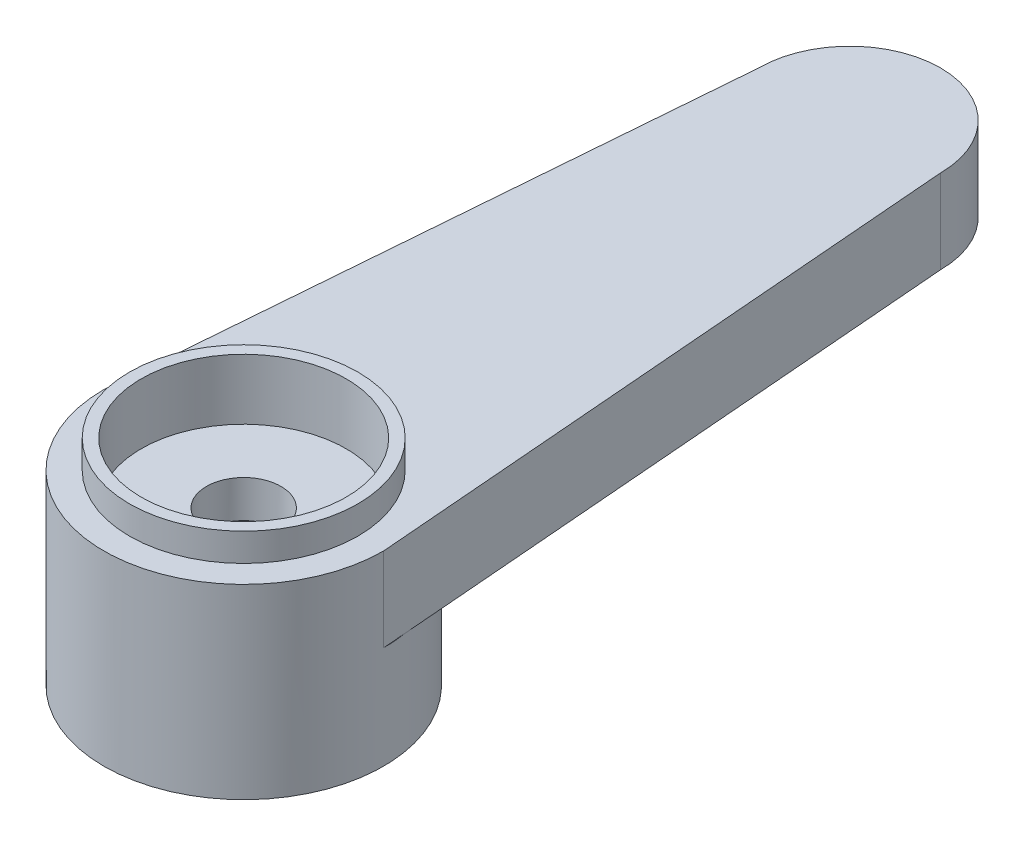
ISO-10303-21;
HEADER;
FILE_DESCRIPTION(('STEP AP214'),'2;1');
FILE_NAME('part.step','',(''),(''),'','','');
FILE_SCHEMA(('AUTOMOTIVE_DESIGN { 1 0 10303 214 1 1 1 1 }'));
ENDSEC;
DATA;
#1=APPLICATION_CONTEXT('core data for automotive mechanical design processes');
#2=APPLICATION_PROTOCOL_DEFINITION('international standard','automotive_design',2000,#1);
#3=PRODUCT_CONTEXT('',#1,'mechanical');
#4=PRODUCT('Part','Part','',(#3));
#5=PRODUCT_RELATED_PRODUCT_CATEGORY('part','',(#4));
#6=PRODUCT_DEFINITION_FORMATION('','',#4);
#7=PRODUCT_DEFINITION_CONTEXT('part definition',#1,'design');
#8=PRODUCT_DEFINITION('design','',#6,#7);
#9=PRODUCT_DEFINITION_SHAPE('','',#8);
#10=(LENGTH_UNIT() NAMED_UNIT(*) SI_UNIT(.MILLI.,.METRE.));
#11=(NAMED_UNIT(*) PLANE_ANGLE_UNIT() SI_UNIT($,.RADIAN.));
#12=(NAMED_UNIT(*) SI_UNIT($,.STERADIAN.) SOLID_ANGLE_UNIT());
#13=UNCERTAINTY_MEASURE_WITH_UNIT(LENGTH_MEASURE(1.E-05),#10,'distance_accuracy_value','');
#14=(GEOMETRIC_REPRESENTATION_CONTEXT(3) GLOBAL_UNCERTAINTY_ASSIGNED_CONTEXT((#13)) GLOBAL_UNIT_ASSIGNED_CONTEXT((#10,
#11,#12)) REPRESENTATION_CONTEXT('',''));
#15=CARTESIAN_POINT('',(0.,0.,0.));
#16=DIRECTION('',(0.,0.,1.));
#17=DIRECTION('',(1.,0.,0.));
#18=AXIS2_PLACEMENT_3D('',#15,#16,#17);
#19=CARTESIAN_POINT('',(0.,-1.9,0.));
#20=DIRECTION('',(0.,1.,0.));
#21=DIRECTION('',(0.,0.,1.));
#22=AXIS2_PLACEMENT_3D('',#19,#20,#21);
#23=CYLINDRICAL_SURFACE('',#22,0.8);
#24=CARTESIAN_POINT('',(0.,1.1,0.));
#25=DIRECTION('',(0.,1.,0.));
#26=DIRECTION('',(0.,0.,1.));
#27=AXIS2_PLACEMENT_3D('',#24,#25,#26);
#28=CIRCLE('',#27,0.8);
#29=CARTESIAN_POINT('',(0.,1.1,0.8));
#30=VERTEX_POINT('',#29);
#31=EDGE_CURVE('E111',#30,#30,#28,.T.);
#32=ORIENTED_EDGE('',*,*,#31,.T.);
#33=EDGE_LOOP('',(#32));
#34=FACE_BOUND('',#33,.T.);
#35=CARTESIAN_POINT('',(0.,0.3,0.));
#36=DIRECTION('',(0.,-1.,0.));
#37=DIRECTION('',(0.,0.,-1.));
#38=AXIS2_PLACEMENT_3D('',#35,#36,#37);
#39=CIRCLE('',#38,0.8);
#40=CARTESIAN_POINT('',(0.,0.3,-0.8));
#41=VERTEX_POINT('',#40);
#42=EDGE_CURVE('E37',#41,#41,#39,.F.);
#43=ORIENTED_EDGE('',*,*,#42,.F.);
#44=EDGE_LOOP('',(#43));
#45=FACE_BOUND('',#44,.T.);
#46=ADVANCED_FACE('F33',(#34,#45),#23,.F.);
#47=CARTESIAN_POINT('',(0.,1.8,0.));
#48=DIRECTION('',(0.,-1.,0.));
#49=DIRECTION('',(0.,0.,-1.));
#50=AXIS2_PLACEMENT_3D('',#47,#48,#49);
#51=CYLINDRICAL_SURFACE('',#50,3.);
#52=DIRECTION('',(0.,-1.,0.));
#53=VECTOR('',#52,1.);
#54=CARTESIAN_POINT('',(-3.,1.8,0.));
#55=LINE('',#54,#53);
#56=CARTESIAN_POINT('',(-3.,1.8,0.));
#57=VERTEX_POINT('',#56);
#58=CARTESIAN_POINT('',(-3.,0.,0.));
#59=VERTEX_POINT('',#58);
#60=EDGE_CURVE('E133',#57,#59,#55,.T.);
#61=ORIENTED_EDGE('',*,*,#60,.T.);
#62=CARTESIAN_POINT('',(0.,0.,0.));
#63=DIRECTION('',(0.,-1.,0.));
#64=DIRECTION('',(0.,0.,-1.));
#65=AXIS2_PLACEMENT_3D('',#62,#63,#64);
#66=CIRCLE('',#65,3.);
#67=CARTESIAN_POINT('',(-2.96111168266192,0.,-0.48147440513809));
#68=VERTEX_POINT('',#67);
#69=EDGE_CURVE('E45',#59,#68,#66,.T.);
#70=ORIENTED_EDGE('',*,*,#69,.T.);
#71=CARTESIAN_POINT('',(2.96111168266192,0.,-0.481474405138107));
#72=VERTEX_POINT('',#71);
#73=EDGE_CURVE('E11',#68,#72,#66,.T.);
#74=ORIENTED_EDGE('',*,*,#73,.T.);
#75=CARTESIAN_POINT('',(3.,0.,0.));
#76=VERTEX_POINT('',#75);
#77=EDGE_CURVE('E44',#72,#76,#66,.T.);
#78=ORIENTED_EDGE('',*,*,#77,.T.);
#79=DIRECTION('',(0.,-1.,0.));
#80=VECTOR('',#79,1.);
#81=CARTESIAN_POINT('',(3.,1.8,0.));
#82=LINE('',#81,#80);
#83=CARTESIAN_POINT('',(3.,1.8,0.));
#84=VERTEX_POINT('',#83);
#85=EDGE_CURVE('E95',#84,#76,#82,.T.);
#86=ORIENTED_EDGE('',*,*,#85,.F.);
#87=CARTESIAN_POINT('',(0.,1.8,0.));
#88=DIRECTION('',(0.,1.,0.));
#89=DIRECTION('',(0.,0.,1.));
#90=AXIS2_PLACEMENT_3D('',#87,#88,#89);
#91=CIRCLE('',#90,3.);
#92=EDGE_CURVE('E127',#57,#84,#91,.T.);
#93=ORIENTED_EDGE('',*,*,#92,.F.);
#94=EDGE_LOOP('',(#61,#70,#74,#78,#86,#93));
#95=FACE_BOUND('',#94,.T.);
#96=CARTESIAN_POINT('',(0.,-2.2,0.));
#97=DIRECTION('',(0.,-1.,0.));
#98=DIRECTION('',(0.,0.,-1.));
#99=AXIS2_PLACEMENT_3D('',#96,#97,#98);
#100=CIRCLE('',#99,3.);
#101=CARTESIAN_POINT('',(0.,-2.2,-3.));
#102=VERTEX_POINT('',#101);
#103=EDGE_CURVE('E109',#102,#102,#100,.T.);
#104=ORIENTED_EDGE('',*,*,#103,.F.);
#105=EDGE_LOOP('',(#104));
#106=FACE_BOUND('',#105,.T.);
#107=ADVANCED_FACE('F35',(#95,#106),#51,.T.);
#108=CARTESIAN_POINT('',(3.,1.8,0.));
#109=DIRECTION('',(-0.996754038756296,0.,0.08050705697647));
#110=DIRECTION('',(0.08050705697647,0.,0.996754038756296));
#111=AXIS2_PLACEMENT_3D('',#108,#109,#110);
#112=PLANE('',#111);
#113=DIRECTION('',(-0.0805070569764699,0.,-0.996754038756296));
#114=VECTOR('',#113,1.);
#115=CARTESIAN_POINT('',(3.,0.,0.));
#116=LINE('',#115,#114);
#117=EDGE_CURVE('E90',#76,#72,#116,.T.);
#118=ORIENTED_EDGE('',*,*,#117,.T.);
#119=CARTESIAN_POINT('',(1.95,0.,-13.));
#120=VERTEX_POINT('',#119);
#121=EDGE_CURVE('E92',#72,#120,#116,.T.);
#122=ORIENTED_EDGE('',*,*,#121,.T.);
#123=DIRECTION('',(0.,-1.,0.));
#124=VECTOR('',#123,1.);
#125=CARTESIAN_POINT('',(1.95,1.8,-13.));
#126=LINE('',#125,#124);
#127=CARTESIAN_POINT('',(1.95,1.8,-13.));
#128=VERTEX_POINT('',#127);
#129=EDGE_CURVE('E141',#128,#120,#126,.T.);
#130=ORIENTED_EDGE('',*,*,#129,.F.);
#131=DIRECTION('',(-0.0805070569764699,0.,-0.996754038756296));
#132=VECTOR('',#131,1.);
#133=CARTESIAN_POINT('',(3.,1.8,0.));
#134=LINE('',#133,#132);
#135=EDGE_CURVE('E86',#84,#128,#134,.T.);
#136=ORIENTED_EDGE('',*,*,#135,.F.);
#137=ORIENTED_EDGE('',*,*,#85,.T.);
#138=EDGE_LOOP('',(#118,#122,#130,#136,#137));
#139=FACE_BOUND('',#138,.T.);
#140=ADVANCED_FACE('F91',(#139),#112,.F.);
#141=CARTESIAN_POINT('',(0.,1.8,-13.));
#142=DIRECTION('',(0.,-1.,0.));
#143=DIRECTION('',(0.,0.,-1.));
#144=AXIS2_PLACEMENT_3D('',#141,#142,#143);
#145=CYLINDRICAL_SURFACE('',#144,1.95);
#146=CARTESIAN_POINT('',(0.,0.,-13.));
#147=DIRECTION('',(0.,1.,0.));
#148=DIRECTION('',(0.,0.,-1.));
#149=AXIS2_PLACEMENT_3D('',#146,#147,#148);
#150=CIRCLE('',#149,1.95);
#151=CARTESIAN_POINT('',(-1.95,0.,-13.));
#152=VERTEX_POINT('',#151);
#153=EDGE_CURVE('E99',#120,#152,#150,.T.);
#154=ORIENTED_EDGE('',*,*,#153,.T.);
#155=DIRECTION('',(0.,-1.,0.));
#156=VECTOR('',#155,1.);
#157=CARTESIAN_POINT('',(-1.95,1.8,-13.));
#158=LINE('',#157,#156);
#159=CARTESIAN_POINT('',(-1.95,1.8,-13.));
#160=VERTEX_POINT('',#159);
#161=EDGE_CURVE('E138',#160,#152,#158,.T.);
#162=ORIENTED_EDGE('',*,*,#161,.F.);
#163=CARTESIAN_POINT('',(0.,1.8,-13.));
#164=DIRECTION('',(0.,1.,0.));
#165=DIRECTION('',(0.,0.,-1.));
#166=AXIS2_PLACEMENT_3D('',#163,#164,#165);
#167=CIRCLE('',#166,1.95);
#168=EDGE_CURVE('E131',#128,#160,#167,.T.);
#169=ORIENTED_EDGE('',*,*,#168,.F.);
#170=ORIENTED_EDGE('',*,*,#129,.T.);
#171=EDGE_LOOP('',(#154,#162,#169,#170));
#172=FACE_BOUND('',#171,.T.);
#173=ADVANCED_FACE('F144',(#172),#145,.T.);
#174=CARTESIAN_POINT('',(-3.,1.8,0.));
#175=DIRECTION('',(0.996754038756296,0.,0.0805070569764701));
#176=DIRECTION('',(0.0805070569764701,0.,-0.996754038756296));
#177=AXIS2_PLACEMENT_3D('',#174,#175,#176);
#178=PLANE('',#177);
#179=DIRECTION('',(-0.0805070569764701,0.,0.996754038756296));
#180=VECTOR('',#179,1.);
#181=CARTESIAN_POINT('',(-3.,0.,0.));
#182=LINE('',#181,#180);
#183=EDGE_CURVE('E129',#152,#68,#182,.T.);
#184=ORIENTED_EDGE('',*,*,#183,.T.);
#185=EDGE_CURVE('E79',#68,#59,#182,.T.);
#186=ORIENTED_EDGE('',*,*,#185,.T.);
#187=ORIENTED_EDGE('',*,*,#60,.F.);
#188=DIRECTION('',(-0.0805070569764701,0.,0.996754038756296));
#189=VECTOR('',#188,1.);
#190=CARTESIAN_POINT('',(-3.,1.8,0.));
#191=LINE('',#190,#189);
#192=EDGE_CURVE('E59',#160,#57,#191,.T.);
#193=ORIENTED_EDGE('',*,*,#192,.F.);
#194=ORIENTED_EDGE('',*,*,#161,.T.);
#195=EDGE_LOOP('',(#184,#186,#187,#193,#194));
#196=FACE_BOUND('',#195,.T.);
#197=ADVANCED_FACE('F191',(#196),#178,.F.);
#198=CARTESIAN_POINT('',(0.,1.8,0.));
#199=DIRECTION('',(0.,1.,0.));
#200=DIRECTION('',(0.,0.,1.));
#201=AXIS2_PLACEMENT_3D('',#198,#199,#200);
#202=PLANE('',#201);
#203=CARTESIAN_POINT('',(0.,1.8,0.));
#204=DIRECTION('',(0.,1.,0.));
#205=DIRECTION('',(0.,0.,1.));
#206=AXIS2_PLACEMENT_3D('',#203,#204,#205);
#207=CIRCLE('',#206,2.45);
#208=CARTESIAN_POINT('',(0.,1.8,2.45));
#209=VERTEX_POINT('',#208);
#210=EDGE_CURVE('E42',#209,#209,#207,.T.);
#211=ORIENTED_EDGE('',*,*,#210,.F.);
#212=EDGE_LOOP('',(#211));
#213=FACE_BOUND('',#212,.T.);
#214=ORIENTED_EDGE('',*,*,#92,.T.);
#215=ORIENTED_EDGE('',*,*,#135,.T.);
#216=ORIENTED_EDGE('',*,*,#168,.T.);
#217=ORIENTED_EDGE('',*,*,#192,.T.);
#218=EDGE_LOOP('',(#214,#215,#216,#217));
#219=FACE_BOUND('',#218,.T.);
#220=ADVANCED_FACE('F146',(#213,#219),#202,.T.);
#221=CARTESIAN_POINT('',(0.,0.,0.));
#222=DIRECTION('',(0.,1.,0.));
#223=DIRECTION('',(0.,0.,1.));
#224=AXIS2_PLACEMENT_3D('',#221,#222,#223);
#225=PLANE('',#224);
#226=ORIENTED_EDGE('',*,*,#73,.F.);
#227=ORIENTED_EDGE('',*,*,#183,.F.);
#228=ORIENTED_EDGE('',*,*,#153,.F.);
#229=ORIENTED_EDGE('',*,*,#121,.F.);
#230=EDGE_LOOP('',(#226,#227,#228,#229));
#231=FACE_BOUND('',#230,.T.);
#232=ADVANCED_FACE('F102',(#231),#225,.F.);
#233=CARTESIAN_POINT('',(0.,2.4,0.));
#234=DIRECTION('',(0.,-1.,0.));
#235=DIRECTION('',(0.,0.,-1.));
#236=AXIS2_PLACEMENT_3D('',#233,#234,#235);
#237=CYLINDRICAL_SURFACE('',#236,2.45);
#238=CARTESIAN_POINT('',(0.,2.4,0.));
#239=DIRECTION('',(0.,1.,0.));
#240=DIRECTION('',(0.,0.,1.));
#241=AXIS2_PLACEMENT_3D('',#238,#239,#240);
#242=CIRCLE('',#241,2.45);
#243=CARTESIAN_POINT('',(0.,2.4,2.45));
#244=VERTEX_POINT('',#243);
#245=EDGE_CURVE('E103',#244,#244,#242,.T.);
#246=ORIENTED_EDGE('',*,*,#245,.F.);
#247=EDGE_LOOP('',(#246));
#248=FACE_BOUND('',#247,.T.);
#249=ORIENTED_EDGE('',*,*,#210,.T.);
#250=EDGE_LOOP('',(#249));
#251=FACE_BOUND('',#250,.T.);
#252=ADVANCED_FACE('F184',(#248,#251),#237,.T.);
#253=CARTESIAN_POINT('',(0.,2.4,0.));
#254=DIRECTION('',(0.,1.,0.));
#255=DIRECTION('',(0.,0.,1.));
#256=AXIS2_PLACEMENT_3D('',#253,#254,#255);
#257=PLANE('',#256);
#258=CARTESIAN_POINT('',(0.,2.4,0.));
#259=DIRECTION('',(0.,1.,0.));
#260=DIRECTION('',(0.,0.,1.));
#261=AXIS2_PLACEMENT_3D('',#258,#259,#260);
#262=CIRCLE('',#261,2.2);
#263=CARTESIAN_POINT('',(0.,2.4,2.2));
#264=VERTEX_POINT('',#263);
#265=EDGE_CURVE('E117',#264,#264,#262,.T.);
#266=ORIENTED_EDGE('',*,*,#265,.F.);
#267=EDGE_LOOP('',(#266));
#268=FACE_BOUND('',#267,.T.);
#269=ORIENTED_EDGE('',*,*,#245,.T.);
#270=EDGE_LOOP('',(#269));
#271=FACE_BOUND('',#270,.T.);
#272=ADVANCED_FACE('F180',(#268,#271),#257,.T.);
#273=CARTESIAN_POINT('',(0.,1.1,0.));
#274=DIRECTION('',(0.,1.,0.));
#275=DIRECTION('',(0.,0.,1.));
#276=AXIS2_PLACEMENT_3D('',#273,#274,#275);
#277=CYLINDRICAL_SURFACE('',#276,2.2);
#278=CARTESIAN_POINT('',(0.,1.1,0.));
#279=DIRECTION('',(0.,1.,0.));
#280=DIRECTION('',(0.,0.,1.));
#281=AXIS2_PLACEMENT_3D('',#278,#279,#280);
#282=CIRCLE('',#281,2.2);
#283=CARTESIAN_POINT('',(0.,1.1,2.2));
#284=VERTEX_POINT('',#283);
#285=EDGE_CURVE('E118',#284,#284,#282,.T.);
#286=ORIENTED_EDGE('',*,*,#285,.F.);
#287=EDGE_LOOP('',(#286));
#288=FACE_BOUND('',#287,.T.);
#289=ORIENTED_EDGE('',*,*,#265,.T.);
#290=EDGE_LOOP('',(#289));
#291=FACE_BOUND('',#290,.T.);
#292=ADVANCED_FACE('F176',(#288,#291),#277,.F.);
#293=CARTESIAN_POINT('',(0.,1.1,0.));
#294=DIRECTION('',(0.,1.,0.));
#295=DIRECTION('',(0.,0.,1.));
#296=AXIS2_PLACEMENT_3D('',#293,#294,#295);
#297=PLANE('',#296);
#298=ORIENTED_EDGE('',*,*,#31,.F.);
#299=EDGE_LOOP('',(#298));
#300=FACE_BOUND('',#299,.T.);
#301=ORIENTED_EDGE('',*,*,#285,.T.);
#302=EDGE_LOOP('',(#301));
#303=FACE_BOUND('',#302,.T.);
#304=ADVANCED_FACE('F165',(#300,#303),#297,.T.);
#305=CARTESIAN_POINT('',(0.,0.,0.));
#306=DIRECTION('',(0.,-1.,0.));
#307=DIRECTION('',(0.,0.,-1.));
#308=AXIS2_PLACEMENT_3D('',#305,#306,#307);
#309=PLANE('',#308);
#310=ORIENTED_EDGE('',*,*,#117,.F.);
#311=ORIENTED_EDGE('',*,*,#77,.F.);
#312=EDGE_LOOP('',(#310,#311));
#313=FACE_BOUND('',#312,.T.);
#314=ADVANCED_FACE('F108',(#313),#309,.F.);
#315=CARTESIAN_POINT('',(0.,-2.2,0.));
#316=DIRECTION('',(0.,-1.,0.));
#317=DIRECTION('',(0.,0.,-1.));
#318=AXIS2_PLACEMENT_3D('',#315,#316,#317);
#319=PLANE('',#318);
#320=CARTESIAN_POINT('',(0.,-2.2,0.));
#321=DIRECTION('',(0.,-1.,0.));
#322=DIRECTION('',(0.,0.,-1.));
#323=AXIS2_PLACEMENT_3D('',#320,#321,#322);
#324=CIRCLE('',#323,1.9);
#325=CARTESIAN_POINT('',(0.,-2.2,-1.9));
#326=VERTEX_POINT('',#325);
#327=EDGE_CURVE('E256',#326,#326,#324,.T.);
#328=ORIENTED_EDGE('',*,*,#327,.F.);
#329=EDGE_LOOP('',(#328));
#330=FACE_BOUND('',#329,.T.);
#331=ORIENTED_EDGE('',*,*,#103,.T.);
#332=EDGE_LOOP('',(#331));
#333=FACE_BOUND('',#332,.T.);
#334=ADVANCED_FACE('F152',(#330,#333),#319,.T.);
#335=ORIENTED_EDGE('',*,*,#185,.F.);
#336=ORIENTED_EDGE('',*,*,#69,.F.);
#337=EDGE_LOOP('',(#335,#336));
#338=FACE_BOUND('',#337,.T.);
#339=ADVANCED_FACE('F149',(#338),#309,.F.);
#340=CARTESIAN_POINT('',(0.,0.3,0.));
#341=DIRECTION('',(0.,-1.,0.));
#342=DIRECTION('',(0.,0.,-1.));
#343=AXIS2_PLACEMENT_3D('',#340,#341,#342);
#344=PLANE('',#343);
#345=CARTESIAN_POINT('',(0.,0.3,0.));
#346=DIRECTION('',(0.,-1.,0.));
#347=DIRECTION('',(0.,0.,-1.));
#348=AXIS2_PLACEMENT_3D('',#345,#346,#347);
#349=CIRCLE('',#348,1.9);
#350=CARTESIAN_POINT('',(0.,0.3,-1.9));
#351=VERTEX_POINT('',#350);
#352=EDGE_CURVE('E253',#351,#351,#349,.T.);
#353=ORIENTED_EDGE('',*,*,#352,.T.);
#354=EDGE_LOOP('',(#353));
#355=FACE_BOUND('',#354,.T.);
#356=ORIENTED_EDGE('',*,*,#42,.T.);
#357=EDGE_LOOP('',(#356));
#358=FACE_BOUND('',#357,.T.);
#359=ADVANCED_FACE('F151',(#355,#358),#344,.T.);
#360=CARTESIAN_POINT('',(0.,0.3,0.));
#361=DIRECTION('',(0.,-1.,0.));
#362=DIRECTION('',(0.,0.,-1.));
#363=AXIS2_PLACEMENT_3D('',#360,#361,#362);
#364=CYLINDRICAL_SURFACE('',#363,1.9);
#365=ORIENTED_EDGE('',*,*,#352,.F.);
#366=EDGE_LOOP('',(#365));
#367=FACE_BOUND('',#366,.T.);
#368=ORIENTED_EDGE('',*,*,#327,.T.);
#369=EDGE_LOOP('',(#368));
#370=FACE_BOUND('',#369,.T.);
#371=ADVANCED_FACE('F158',(#367,#370),#364,.F.);
#372=CLOSED_SHELL('',(#46,#107,#140,#173,#197,#220,#232,#252,#272,#292,#304,#314,#334,#339,#359,#371));
#373=MANIFOLD_SOLID_BREP('B2',#372);
#374=ADVANCED_BREP_SHAPE_REPRESENTATION('',(#18,#373),#14);
#375=SHAPE_DEFINITION_REPRESENTATION(#9,#374);
ENDSEC;
END-ISO-10303-21;
